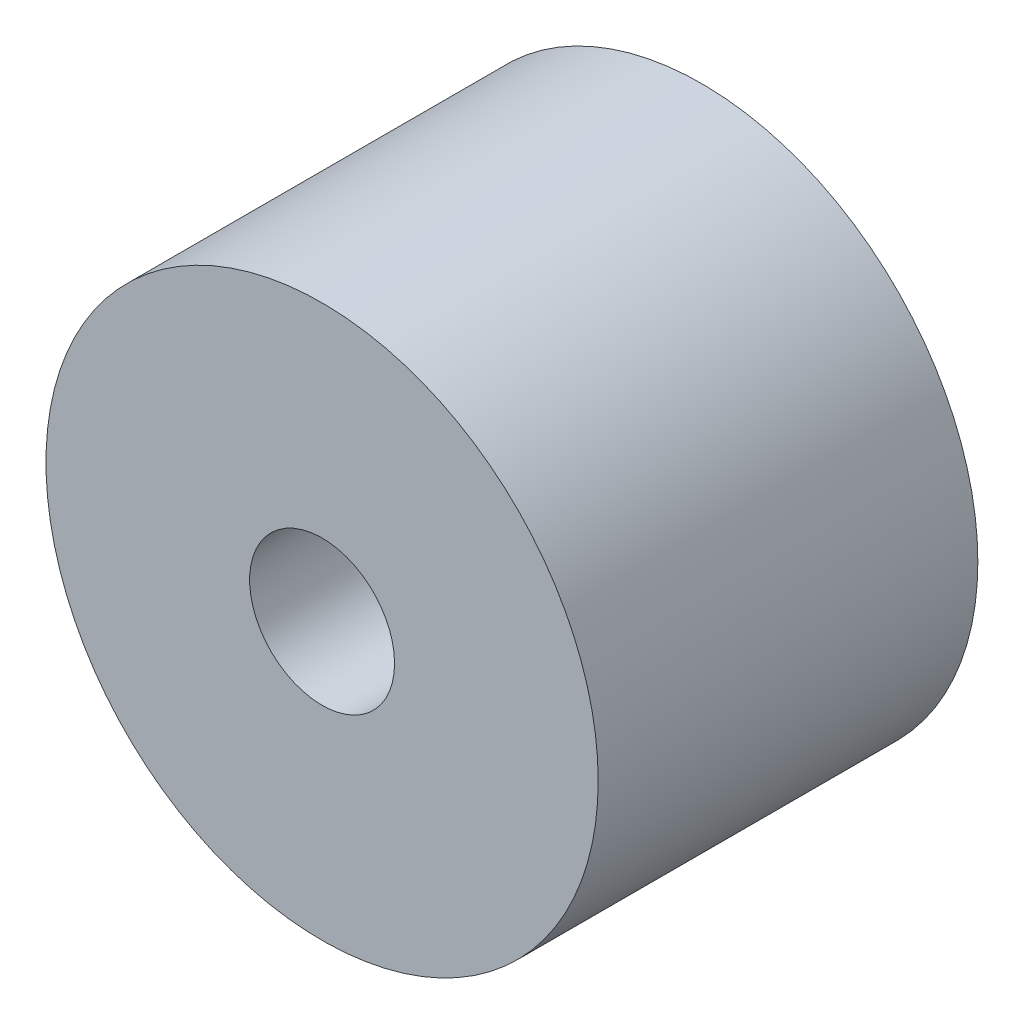
ISO-10303-21;
HEADER;
FILE_DESCRIPTION(('STEP AP214'),'2;1');
FILE_NAME('part.step','',(''),(''),'','','');
FILE_SCHEMA(('AUTOMOTIVE_DESIGN { 1 0 10303 214 1 1 1 1 }'));
ENDSEC;
DATA;
#1=APPLICATION_CONTEXT('core data for automotive mechanical design processes');
#2=APPLICATION_PROTOCOL_DEFINITION('international standard','automotive_design',2000,#1);
#3=PRODUCT_CONTEXT('',#1,'mechanical');
#4=PRODUCT('Part','Part','',(#3));
#5=PRODUCT_RELATED_PRODUCT_CATEGORY('part','',(#4));
#6=PRODUCT_DEFINITION_FORMATION('','',#4);
#7=PRODUCT_DEFINITION_CONTEXT('part definition',#1,'design');
#8=PRODUCT_DEFINITION('design','',#6,#7);
#9=PRODUCT_DEFINITION_SHAPE('','',#8);
#10=(LENGTH_UNIT() NAMED_UNIT(*) SI_UNIT(.MILLI.,.METRE.));
#11=(NAMED_UNIT(*) PLANE_ANGLE_UNIT() SI_UNIT($,.RADIAN.));
#12=(NAMED_UNIT(*) SI_UNIT($,.STERADIAN.) SOLID_ANGLE_UNIT());
#13=UNCERTAINTY_MEASURE_WITH_UNIT(LENGTH_MEASURE(1.E-05),#10,'distance_accuracy_value','');
#14=(GEOMETRIC_REPRESENTATION_CONTEXT(3) GLOBAL_UNCERTAINTY_ASSIGNED_CONTEXT((#13)) GLOBAL_UNIT_ASSIGNED_CONTEXT((#10,
#11,#12)) REPRESENTATION_CONTEXT('',''));
#15=CARTESIAN_POINT('',(0.,0.,0.));
#16=DIRECTION('',(0.,0.,1.));
#17=DIRECTION('',(1.,0.,0.));
#18=AXIS2_PLACEMENT_3D('',#15,#16,#17);
#19=CARTESIAN_POINT('',(0.,0.,5.5));
#20=DIRECTION('',(0.,0.,1.));
#21=DIRECTION('',(1.,0.,0.));
#22=AXIS2_PLACEMENT_3D('',#19,#20,#21);
#23=PLANE('',#22);
#24=CARTESIAN_POINT('',(0.,0.,5.5));
#25=DIRECTION('',(0.,0.,1.));
#26=DIRECTION('',(1.,0.,0.));
#27=AXIS2_PLACEMENT_3D('',#24,#25,#26);
#28=CIRCLE('',#27,4.);
#29=CARTESIAN_POINT('',(4.,0.,5.5));
#30=VERTEX_POINT('',#29);
#31=EDGE_CURVE('E10',#30,#30,#28,.T.);
#32=ORIENTED_EDGE('',*,*,#31,.T.);
#33=EDGE_LOOP('',(#32));
#34=FACE_BOUND('',#33,.T.);
#35=CARTESIAN_POINT('',(0.,0.,5.5));
#36=DIRECTION('',(0.,0.,1.));
#37=DIRECTION('',(1.,0.,0.));
#38=AXIS2_PLACEMENT_3D('',#35,#36,#37);
#39=CIRCLE('',#38,1.05);
#40=CARTESIAN_POINT('',(1.05,0.,5.5));
#41=VERTEX_POINT('',#40);
#42=EDGE_CURVE('E42',#41,#41,#39,.T.);
#43=ORIENTED_EDGE('',*,*,#42,.F.);
#44=EDGE_LOOP('',(#43));
#45=FACE_BOUND('',#44,.T.);
#46=ADVANCED_FACE('F31',(#34,#45),#23,.T.);
#47=CARTESIAN_POINT('',(0.,0.,0.));
#48=DIRECTION('',(0.,0.,1.));
#49=DIRECTION('',(1.,0.,0.));
#50=AXIS2_PLACEMENT_3D('',#47,#48,#49);
#51=PLANE('',#50);
#52=CARTESIAN_POINT('',(0.,0.,0.));
#53=DIRECTION('',(0.,0.,1.));
#54=DIRECTION('',(1.,0.,0.));
#55=AXIS2_PLACEMENT_3D('',#52,#53,#54);
#56=CIRCLE('',#55,4.);
#57=CARTESIAN_POINT('',(4.,0.,0.));
#58=VERTEX_POINT('',#57);
#59=EDGE_CURVE('E35',#58,#58,#56,.T.);
#60=ORIENTED_EDGE('',*,*,#59,.F.);
#61=EDGE_LOOP('',(#60));
#62=FACE_BOUND('',#61,.T.);
#63=CARTESIAN_POINT('',(0.,0.,0.));
#64=DIRECTION('',(0.,0.,1.));
#65=DIRECTION('',(1.,0.,0.));
#66=AXIS2_PLACEMENT_3D('',#63,#64,#65);
#67=CIRCLE('',#66,1.05);
#68=CARTESIAN_POINT('',(1.05,0.,0.));
#69=VERTEX_POINT('',#68);
#70=EDGE_CURVE('E44',#69,#69,#67,.T.);
#71=ORIENTED_EDGE('',*,*,#70,.T.);
#72=EDGE_LOOP('',(#71));
#73=FACE_BOUND('',#72,.T.);
#74=ADVANCED_FACE('F54',(#62,#73),#51,.F.);
#75=CARTESIAN_POINT('',(0.,0.,5.5));
#76=DIRECTION('',(0.,0.,-1.));
#77=DIRECTION('',(-1.,0.,0.));
#78=AXIS2_PLACEMENT_3D('',#75,#76,#77);
#79=CYLINDRICAL_SURFACE('',#78,4.);
#80=ORIENTED_EDGE('',*,*,#31,.F.);
#81=EDGE_LOOP('',(#80));
#82=FACE_BOUND('',#81,.T.);
#83=ORIENTED_EDGE('',*,*,#59,.T.);
#84=EDGE_LOOP('',(#83));
#85=FACE_BOUND('',#84,.T.);
#86=ADVANCED_FACE('F33',(#82,#85),#79,.T.);
#87=CARTESIAN_POINT('',(0.,0.,5.5));
#88=DIRECTION('',(0.,0.,-1.));
#89=DIRECTION('',(-1.,0.,0.));
#90=AXIS2_PLACEMENT_3D('',#87,#88,#89);
#91=CYLINDRICAL_SURFACE('',#90,1.05);
#92=ORIENTED_EDGE('',*,*,#42,.T.);
#93=EDGE_LOOP('',(#92));
#94=FACE_BOUND('',#93,.T.);
#95=ORIENTED_EDGE('',*,*,#70,.F.);
#96=EDGE_LOOP('',(#95));
#97=FACE_BOUND('',#96,.T.);
#98=ADVANCED_FACE('F50',(#94,#97),#91,.F.);
#99=CLOSED_SHELL('',(#46,#74,#86,#98));
#100=MANIFOLD_SOLID_BREP('B2',#99);
#101=ADVANCED_BREP_SHAPE_REPRESENTATION('',(#18,#100),#14);
#102=SHAPE_DEFINITION_REPRESENTATION(#9,#101);
ENDSEC;
END-ISO-10303-21;
